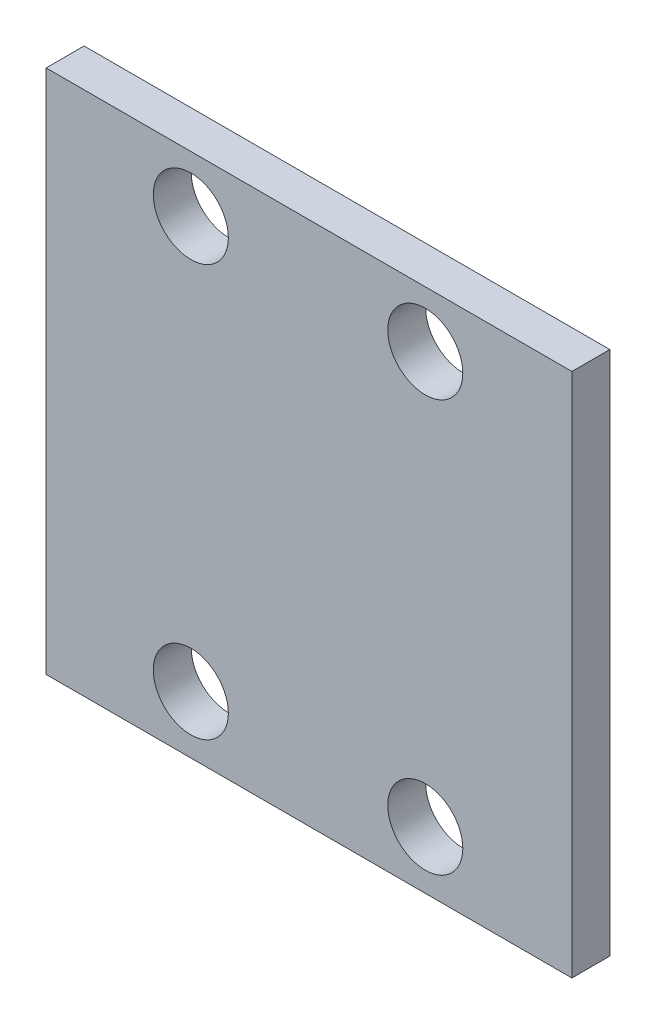
ISO-10303-21;
HEADER;
FILE_DESCRIPTION(('STEP AP214'),'2;1');
FILE_NAME('part.step','',(''),(''),'','','');
FILE_SCHEMA(('AUTOMOTIVE_DESIGN { 1 0 10303 214 1 1 1 1 }'));
ENDSEC;
DATA;
#1=APPLICATION_CONTEXT('core data for automotive mechanical design processes');
#2=APPLICATION_PROTOCOL_DEFINITION('international standard','automotive_design',2000,#1);
#3=PRODUCT_CONTEXT('',#1,'mechanical');
#4=PRODUCT('Part','Part','',(#3));
#5=PRODUCT_RELATED_PRODUCT_CATEGORY('part','',(#4));
#6=PRODUCT_DEFINITION_FORMATION('','',#4);
#7=PRODUCT_DEFINITION_CONTEXT('part definition',#1,'design');
#8=PRODUCT_DEFINITION('design','',#6,#7);
#9=PRODUCT_DEFINITION_SHAPE('','',#8);
#10=(LENGTH_UNIT() NAMED_UNIT(*) SI_UNIT(.MILLI.,.METRE.));
#11=(NAMED_UNIT(*) PLANE_ANGLE_UNIT() SI_UNIT($,.RADIAN.));
#12=(NAMED_UNIT(*) SI_UNIT($,.STERADIAN.) SOLID_ANGLE_UNIT());
#13=UNCERTAINTY_MEASURE_WITH_UNIT(LENGTH_MEASURE(1.E-05),#10,'distance_accuracy_value','');
#14=(GEOMETRIC_REPRESENTATION_CONTEXT(3) GLOBAL_UNCERTAINTY_ASSIGNED_CONTEXT((#13)) GLOBAL_UNIT_ASSIGNED_CONTEXT((#10,
#11,#12)) REPRESENTATION_CONTEXT('',''));
#15=CARTESIAN_POINT('',(0.,0.,0.));
#16=DIRECTION('',(0.,0.,1.));
#17=DIRECTION('',(1.,0.,0.));
#18=AXIS2_PLACEMENT_3D('',#15,#16,#17);
#19=CARTESIAN_POINT('',(0.,0.,-0.825000000000005));
#20=DIRECTION('',(0.,0.,-0.999999999999998));
#21=DIRECTION('',(-1.,0.,0.));
#22=AXIS2_PLACEMENT_3D('',#19,#20,#21);
#23=PLANE('',#22);
#24=CARTESIAN_POINT('',(6.28965873178001,2.50328072576878,-0.825000000000008));
#25=DIRECTION('',(0.,0.,0.999999999999998));
#26=DIRECTION('',(1.,0.,0.));
#27=AXIS2_PLACEMENT_3D('',#24,#25,#26);
#28=CIRCLE('',#27,1.63195);
#29=CARTESIAN_POINT('',(7.92160873178001,2.50328072576877,-0.825000000000008));
#30=VERTEX_POINT('',#29);
#31=EDGE_CURVE('E117',#30,#30,#28,.T.);
#32=ORIENTED_EDGE('',*,*,#31,.T.);
#33=EDGE_LOOP('',(#32));
#34=FACE_BOUND('',#33,.T.);
#35=CARTESIAN_POINT('',(16.4835065175485,2.50328072576879,-0.825000000000001));
#36=DIRECTION('',(0.,0.,0.999999999999998));
#37=DIRECTION('',(1.,0.,0.));
#38=AXIS2_PLACEMENT_3D('',#35,#36,#37);
#39=CIRCLE('',#38,1.63195);
#40=CARTESIAN_POINT('',(18.1154565175485,2.50328072576878,-0.825000000000001));
#41=VERTEX_POINT('',#40);
#42=EDGE_CURVE('E101',#41,#41,#39,.T.);
#43=ORIENTED_EDGE('',*,*,#42,.T.);
#44=EDGE_LOOP('',(#43));
#45=FACE_BOUND('',#44,.T.);
#46=DIRECTION('',(0.,0.999999999999999,0.));
#47=VECTOR('',#46,1.);
#48=CARTESIAN_POINT('',(22.8588639770681,0.,-0.824999999999999));
#49=LINE('',#48,#47);
#50=CARTESIAN_POINT('',(22.8588639770681,0.,-0.824999999999999));
#51=VERTEX_POINT('',#50);
#52=CARTESIAN_POINT('',(22.8588639770681,22.8397797418369,-0.825000000000005));
#53=VERTEX_POINT('',#52);
#54=EDGE_CURVE('E98',#51,#53,#49,.T.);
#55=ORIENTED_EDGE('',*,*,#54,.F.);
#56=DIRECTION('',(1.,0.,0.));
#57=VECTOR('',#56,1.);
#58=CARTESIAN_POINT('',(0.,0.,-0.825000000000005));
#59=LINE('',#58,#57);
#60=CARTESIAN_POINT('',(0.,0.,-0.825000000000005));
#61=VERTEX_POINT('',#60);
#62=EDGE_CURVE('E74',#61,#51,#59,.T.);
#63=ORIENTED_EDGE('',*,*,#62,.F.);
#64=DIRECTION('',(0.,-0.999999999999999,0.));
#65=VECTOR('',#64,1.);
#66=CARTESIAN_POINT('',(0.,0.,-0.825000000000005));
#67=LINE('',#66,#65);
#68=CARTESIAN_POINT('',(0.,22.8397797418369,-0.825000000000003));
#69=VERTEX_POINT('',#68);
#70=EDGE_CURVE('E68',#69,#61,#67,.T.);
#71=ORIENTED_EDGE('',*,*,#70,.F.);
#72=DIRECTION('',(-1.,0.,0.));
#73=VECTOR('',#72,1.);
#74=CARTESIAN_POINT('',(0.,22.8397797418369,-0.825000000000003));
#75=LINE('',#74,#73);
#76=EDGE_CURVE('E90',#53,#69,#75,.T.);
#77=ORIENTED_EDGE('',*,*,#76,.F.);
#78=EDGE_LOOP('',(#55,#63,#71,#77));
#79=FACE_BOUND('',#78,.T.);
#80=CARTESIAN_POINT('',(6.28965873178,20.4007563309219,-0.825000000000004));
#81=DIRECTION('',(0.,0.,0.999999999999998));
#82=DIRECTION('',(1.,0.,0.));
#83=AXIS2_PLACEMENT_3D('',#80,#81,#82);
#84=CIRCLE('',#83,1.63195);
#85=CARTESIAN_POINT('',(7.92160873178001,20.4007563309219,-0.825000000000004));
#86=VERTEX_POINT('',#85);
#87=EDGE_CURVE('E123',#86,#86,#84,.T.);
#88=ORIENTED_EDGE('',*,*,#87,.T.);
#89=EDGE_LOOP('',(#88));
#90=FACE_BOUND('',#89,.T.);
#91=CARTESIAN_POINT('',(16.4835065175485,20.4007563309218,-0.825000000000007));
#92=DIRECTION('',(0.,0.,0.999999999999998));
#93=DIRECTION('',(1.,0.,0.));
#94=AXIS2_PLACEMENT_3D('',#91,#92,#93);
#95=CIRCLE('',#94,1.63195);
#96=CARTESIAN_POINT('',(18.1154565175485,20.4007563309218,-0.825000000000007));
#97=VERTEX_POINT('',#96);
#98=EDGE_CURVE('E129',#97,#97,#95,.T.);
#99=ORIENTED_EDGE('',*,*,#98,.T.);
#100=EDGE_LOOP('',(#99));
#101=FACE_BOUND('',#100,.T.);
#102=ADVANCED_FACE('F34',(#34,#45,#79,#90,#101),#23,.T.);
#103=CARTESIAN_POINT('',(22.8588639770681,0.,0.824999999999994));
#104=DIRECTION('',(-1.,0.,0.));
#105=DIRECTION('',(0.,0.,0.999999999999998));
#106=AXIS2_PLACEMENT_3D('',#103,#104,#105);
#107=PLANE('',#106);
#108=ORIENTED_EDGE('',*,*,#54,.T.);
#109=DIRECTION('',(0.,0.,-0.999999999999998));
#110=VECTOR('',#109,1.);
#111=CARTESIAN_POINT('',(22.8588639770681,22.8397797418369,0.824999999999994));
#112=LINE('',#111,#110);
#113=CARTESIAN_POINT('',(22.8588639770681,22.8397797418369,0.824999999999994));
#114=VERTEX_POINT('',#113);
#115=EDGE_CURVE('E11',#114,#53,#112,.T.);
#116=ORIENTED_EDGE('',*,*,#115,.F.);
#117=DIRECTION('',(0.,0.999999999999999,0.));
#118=VECTOR('',#117,1.);
#119=CARTESIAN_POINT('',(22.8588639770681,0.,0.824999999999994));
#120=LINE('',#119,#118);
#121=CARTESIAN_POINT('',(22.8588639770681,0.,0.824999999999994));
#122=VERTEX_POINT('',#121);
#123=EDGE_CURVE('E86',#122,#114,#120,.T.);
#124=ORIENTED_EDGE('',*,*,#123,.F.);
#125=DIRECTION('',(0.,0.,-0.999999999999998));
#126=VECTOR('',#125,1.);
#127=CARTESIAN_POINT('',(22.8588639770681,0.,0.824999999999994));
#128=LINE('',#127,#126);
#129=EDGE_CURVE('E94',#122,#51,#128,.T.);
#130=ORIENTED_EDGE('',*,*,#129,.T.);
#131=EDGE_LOOP('',(#108,#116,#124,#130));
#132=FACE_BOUND('',#131,.T.);
#133=ADVANCED_FACE('F36',(#132),#107,.F.);
#134=CARTESIAN_POINT('',(0.,22.8397797418369,0.824999999999993));
#135=DIRECTION('',(0.,-0.999999999999999,0.));
#136=DIRECTION('',(0.,0.,-0.999999999999998));
#137=AXIS2_PLACEMENT_3D('',#134,#135,#136);
#138=PLANE('',#137);
#139=ORIENTED_EDGE('',*,*,#76,.T.);
#140=DIRECTION('',(0.,0.,-0.999999999999998));
#141=VECTOR('',#140,1.);
#142=CARTESIAN_POINT('',(0.,22.8397797418369,0.824999999999993));
#143=LINE('',#142,#141);
#144=CARTESIAN_POINT('',(0.,22.8397797418369,0.824999999999993));
#145=VERTEX_POINT('',#144);
#146=EDGE_CURVE('E43',#145,#69,#143,.T.);
#147=ORIENTED_EDGE('',*,*,#146,.F.);
#148=DIRECTION('',(-1.,0.,0.));
#149=VECTOR('',#148,1.);
#150=CARTESIAN_POINT('',(0.,22.8397797418369,0.824999999999993));
#151=LINE('',#150,#149);
#152=EDGE_CURVE('E81',#114,#145,#151,.T.);
#153=ORIENTED_EDGE('',*,*,#152,.F.);
#154=ORIENTED_EDGE('',*,*,#115,.T.);
#155=EDGE_LOOP('',(#139,#147,#153,#154));
#156=FACE_BOUND('',#155,.T.);
#157=ADVANCED_FACE('F89',(#156),#138,.F.);
#158=CARTESIAN_POINT('',(0.,0.,0.824999999999992));
#159=DIRECTION('',(1.,0.,0.));
#160=DIRECTION('',(0.,0.,-0.999999999999998));
#161=AXIS2_PLACEMENT_3D('',#158,#159,#160);
#162=PLANE('',#161);
#163=ORIENTED_EDGE('',*,*,#70,.T.);
#164=DIRECTION('',(0.,0.,-0.999999999999998));
#165=VECTOR('',#164,1.);
#166=CARTESIAN_POINT('',(0.,0.,0.824999999999992));
#167=LINE('',#166,#165);
#168=CARTESIAN_POINT('',(0.,0.,0.824999999999992));
#169=VERTEX_POINT('',#168);
#170=EDGE_CURVE('E91',#169,#61,#167,.T.);
#171=ORIENTED_EDGE('',*,*,#170,.F.);
#172=DIRECTION('',(0.,-0.999999999999999,0.));
#173=VECTOR('',#172,1.);
#174=CARTESIAN_POINT('',(0.,0.,0.824999999999992));
#175=LINE('',#174,#173);
#176=EDGE_CURVE('E84',#145,#169,#175,.T.);
#177=ORIENTED_EDGE('',*,*,#176,.F.);
#178=ORIENTED_EDGE('',*,*,#146,.T.);
#179=EDGE_LOOP('',(#163,#171,#177,#178));
#180=FACE_BOUND('',#179,.T.);
#181=ADVANCED_FACE('F92',(#180),#162,.F.);
#182=CARTESIAN_POINT('',(0.,0.,0.824999999999992));
#183=DIRECTION('',(0.,0.999999999999999,0.));
#184=DIRECTION('',(0.,0.,0.999999999999998));
#185=AXIS2_PLACEMENT_3D('',#182,#183,#184);
#186=PLANE('',#185);
#187=ORIENTED_EDGE('',*,*,#62,.T.);
#188=ORIENTED_EDGE('',*,*,#129,.F.);
#189=DIRECTION('',(1.,0.,0.));
#190=VECTOR('',#189,1.);
#191=CARTESIAN_POINT('',(0.,0.,0.824999999999992));
#192=LINE('',#191,#190);
#193=EDGE_CURVE('E51',#169,#122,#192,.T.);
#194=ORIENTED_EDGE('',*,*,#193,.F.);
#195=ORIENTED_EDGE('',*,*,#170,.T.);
#196=EDGE_LOOP('',(#187,#188,#194,#195));
#197=FACE_BOUND('',#196,.T.);
#198=ADVANCED_FACE('F106',(#197),#186,.F.);
#199=CARTESIAN_POINT('',(0.,0.,0.824999999999992));
#200=DIRECTION('',(0.,0.,-0.999999999999998));
#201=DIRECTION('',(-1.,0.,0.));
#202=AXIS2_PLACEMENT_3D('',#199,#200,#201);
#203=PLANE('',#202);
#204=CARTESIAN_POINT('',(16.4835065175485,20.4007563309218,0.824999999999992));
#205=DIRECTION('',(0.,0.,0.999999999999998));
#206=DIRECTION('',(1.,0.,0.));
#207=AXIS2_PLACEMENT_3D('',#204,#205,#206);
#208=CIRCLE('',#207,1.63195);
#209=CARTESIAN_POINT('',(18.1154565175485,20.4007563309218,0.824999999999991));
#210=VERTEX_POINT('',#209);
#211=EDGE_CURVE('E132',#210,#210,#208,.T.);
#212=ORIENTED_EDGE('',*,*,#211,.F.);
#213=EDGE_LOOP('',(#212));
#214=FACE_BOUND('',#213,.T.);
#215=CARTESIAN_POINT('',(6.28965873178001,20.4007563309219,0.825000000000001));
#216=DIRECTION('',(0.,0.,0.999999999999998));
#217=DIRECTION('',(1.,0.,0.));
#218=AXIS2_PLACEMENT_3D('',#215,#216,#217);
#219=CIRCLE('',#218,1.63195);
#220=CARTESIAN_POINT('',(7.92160873178001,20.4007563309219,0.825000000000001));
#221=VERTEX_POINT('',#220);
#222=EDGE_CURVE('E126',#221,#221,#219,.T.);
#223=ORIENTED_EDGE('',*,*,#222,.F.);
#224=EDGE_LOOP('',(#223));
#225=FACE_BOUND('',#224,.T.);
#226=CARTESIAN_POINT('',(6.28965873178001,2.50328072576877,0.824999999999992));
#227=DIRECTION('',(0.,0.,0.999999999999998));
#228=DIRECTION('',(1.,0.,0.));
#229=AXIS2_PLACEMENT_3D('',#226,#227,#228);
#230=CIRCLE('',#229,1.63195);
#231=CARTESIAN_POINT('',(7.92160873178001,2.50328072576877,0.824999999999992));
#232=VERTEX_POINT('',#231);
#233=EDGE_CURVE('E120',#232,#232,#230,.T.);
#234=ORIENTED_EDGE('',*,*,#233,.F.);
#235=EDGE_LOOP('',(#234));
#236=FACE_BOUND('',#235,.T.);
#237=CARTESIAN_POINT('',(16.4835065175485,2.50328072576878,0.824999999999999));
#238=DIRECTION('',(0.,0.,0.999999999999998));
#239=DIRECTION('',(1.,0.,0.));
#240=AXIS2_PLACEMENT_3D('',#237,#238,#239);
#241=CIRCLE('',#240,1.63195);
#242=CARTESIAN_POINT('',(18.1154565175485,2.50328072576878,0.824999999999999));
#243=VERTEX_POINT('',#242);
#244=EDGE_CURVE('E114',#243,#243,#241,.T.);
#245=ORIENTED_EDGE('',*,*,#244,.F.);
#246=EDGE_LOOP('',(#245));
#247=FACE_BOUND('',#246,.T.);
#248=ORIENTED_EDGE('',*,*,#123,.T.);
#249=ORIENTED_EDGE('',*,*,#152,.T.);
#250=ORIENTED_EDGE('',*,*,#176,.T.);
#251=ORIENTED_EDGE('',*,*,#193,.T.);
#252=EDGE_LOOP('',(#248,#249,#250,#251));
#253=FACE_BOUND('',#252,.T.);
#254=ADVANCED_FACE('F82',(#214,#225,#236,#247,#253),#203,.F.);
#255=CARTESIAN_POINT('',(16.4835065175485,2.50328072576878,0.824999999999999));
#256=DIRECTION('',(0.,0.,0.999999999999998));
#257=DIRECTION('',(1.,0.,0.));
#258=AXIS2_PLACEMENT_3D('',#255,#256,#257);
#259=CYLINDRICAL_SURFACE('',#258,1.63195);
#260=CARTESIAN_POINT('',(18.1154565175485,2.50328072576878,-0.825000000000001));
#261=CARTESIAN_POINT('',(18.1154565175485,2.50328072576878,-0.807812500000001));
#262=CARTESIAN_POINT('',(18.1154565175485,2.50328072576878,-0.790625000000001));
#263=CARTESIAN_POINT('',(18.1154565175485,2.50328072576878,-0.756250000000001));
#264=CARTESIAN_POINT('',(18.1154565175485,2.50328072576878,-0.739062500000001));
#265=CARTESIAN_POINT('',(18.1154565175485,2.50328072576878,-0.704687500000001));
#266=CARTESIAN_POINT('',(18.1154565175485,2.50328072576878,-0.687500000000001));
#267=CARTESIAN_POINT('',(18.1154565175485,2.50328072576878,-0.653125000000001));
#268=CARTESIAN_POINT('',(18.1154565175485,2.50328072576878,-0.635937500000001));
#269=CARTESIAN_POINT('',(18.1154565175485,2.50328072576878,-0.601562500000001));
#270=CARTESIAN_POINT('',(18.1154565175485,2.50328072576878,-0.584375000000001));
#271=CARTESIAN_POINT('',(18.1154565175485,2.50328072576878,-0.550000000000001));
#272=CARTESIAN_POINT('',(18.1154565175485,2.50328072576878,-0.532812500000001));
#273=CARTESIAN_POINT('',(18.1154565175485,2.50328072576878,-0.498437500000001));
#274=CARTESIAN_POINT('',(18.1154565175485,2.50328072576878,-0.481250000000001));
#275=CARTESIAN_POINT('',(18.1154565175485,2.50328072576878,-0.446875000000001));
#276=CARTESIAN_POINT('',(18.1154565175485,2.50328072576878,-0.429687500000001));
#277=CARTESIAN_POINT('',(18.1154565175485,2.50328072576878,-0.395312500000001));
#278=CARTESIAN_POINT('',(18.1154565175485,2.50328072576878,-0.378125000000001));
#279=CARTESIAN_POINT('',(18.1154565175485,2.50328072576878,-0.343750000000001));
#280=CARTESIAN_POINT('',(18.1154565175485,2.50328072576878,-0.326562500000001));
#281=CARTESIAN_POINT('',(18.1154565175485,2.50328072576878,-0.292187500000001));
#282=CARTESIAN_POINT('',(18.1154565175485,2.50328072576878,-0.275000000000001));
#283=CARTESIAN_POINT('',(18.1154565175485,2.50328072576878,-0.240625000000001));
#284=CARTESIAN_POINT('',(18.1154565175485,2.50328072576878,-0.223437500000001));
#285=CARTESIAN_POINT('',(18.1154565175485,2.50328072576878,-0.189062500000001));
#286=CARTESIAN_POINT('',(18.1154565175485,2.50328072576878,-0.171875000000001));
#287=CARTESIAN_POINT('',(18.1154565175485,2.50328072576878,-0.137500000000001));
#288=CARTESIAN_POINT('',(18.1154565175485,2.50328072576878,-0.120312500000001));
#289=CARTESIAN_POINT('',(18.1154565175485,2.50328072576878,-0.0859375000000009));
#290=CARTESIAN_POINT('',(18.1154565175485,2.50328072576878,-0.0687500000000008));
#291=CARTESIAN_POINT('',(18.1154565175485,2.50328072576878,-0.0343750000000008));
#292=CARTESIAN_POINT('',(18.1154565175485,2.50328072576878,-0.0171875000000009));
#293=CARTESIAN_POINT('',(18.1154565175485,2.50328072576878,0.0171874999999991));
#294=CARTESIAN_POINT('',(18.1154565175485,2.50328072576878,0.0343749999999991));
#295=CARTESIAN_POINT('',(18.1154565175485,2.50328072576878,0.0687499999999991));
#296=CARTESIAN_POINT('',(18.1154565175485,2.50328072576878,0.0859374999999991));
#297=CARTESIAN_POINT('',(18.1154565175485,2.50328072576878,0.120312499999999));
#298=CARTESIAN_POINT('',(18.1154565175485,2.50328072576878,0.137499999999999));
#299=CARTESIAN_POINT('',(18.1154565175485,2.50328072576878,0.171874999999999));
#300=CARTESIAN_POINT('',(18.1154565175485,2.50328072576878,0.189062499999999));
#301=CARTESIAN_POINT('',(18.1154565175485,2.50328072576878,0.223437499999999));
#302=CARTESIAN_POINT('',(18.1154565175485,2.50328072576878,0.240624999999999));
#303=CARTESIAN_POINT('',(18.1154565175485,2.50328072576878,0.274999999999999));
#304=CARTESIAN_POINT('',(18.1154565175485,2.50328072576878,0.292187499999999));
#305=CARTESIAN_POINT('',(18.1154565175485,2.50328072576878,0.326562499999999));
#306=CARTESIAN_POINT('',(18.1154565175485,2.50328072576878,0.343749999999999));
#307=CARTESIAN_POINT('',(18.1154565175485,2.50328072576878,0.378124999999999));
#308=CARTESIAN_POINT('',(18.1154565175485,2.50328072576878,0.395312499999999));
#309=CARTESIAN_POINT('',(18.1154565175485,2.50328072576878,0.429687499999999));
#310=CARTESIAN_POINT('',(18.1154565175485,2.50328072576878,0.446874999999999));
#311=CARTESIAN_POINT('',(18.1154565175485,2.50328072576878,0.481249999999999));
#312=CARTESIAN_POINT('',(18.1154565175485,2.50328072576878,0.498437499999999));
#313=CARTESIAN_POINT('',(18.1154565175485,2.50328072576878,0.532812499999999));
#314=CARTESIAN_POINT('',(18.1154565175485,2.50328072576878,0.549999999999999));
#315=CARTESIAN_POINT('',(18.1154565175485,2.50328072576878,0.584374999999999));
#316=CARTESIAN_POINT('',(18.1154565175485,2.50328072576878,0.601562499999999));
#317=CARTESIAN_POINT('',(18.1154565175485,2.50328072576878,0.635937499999999));
#318=CARTESIAN_POINT('',(18.1154565175485,2.50328072576878,0.653124999999999));
#319=CARTESIAN_POINT('',(18.1154565175485,2.50328072576878,0.687499999999999));
#320=CARTESIAN_POINT('',(18.1154565175485,2.50328072576878,0.704687499999999));
#321=CARTESIAN_POINT('',(18.1154565175485,2.50328072576878,0.739062499999999));
#322=CARTESIAN_POINT('',(18.1154565175485,2.50328072576878,0.756249999999999));
#323=CARTESIAN_POINT('',(18.1154565175485,2.50328072576878,0.790624999999999));
#324=CARTESIAN_POINT('',(18.1154565175485,2.50328072576878,0.807812499999999));
#325=CARTESIAN_POINT('',(18.1154565175485,2.50328072576878,0.824999999999999));
#326=B_SPLINE_CURVE_WITH_KNOTS('',3,(#260,#261,#262,#263,#264,#265,#266,#267,#268,#269,#270,
#271,#272,#273,#274,#275,#276,#277,#278,#279,#280,#281,#282,#283,#284,#285,#286,#287,#288,#289,
#290,#291,#292,#293,#294,#295,#296,#297,#298,#299,#300,#301,#302,#303,#304,#305,#306,#307,#308,
#309,#310,#311,#312,#313,#314,#315,#316,#317,#318,#319,#320,#321,#322,#323,#324,#325),
.UNSPECIFIED.,.F.,.F.,(4,2,2,2,2,2,2,2,2,2,2,2,2,2,2,2,2,2,2,2,2,2,2,2,2,2,2,2,2,2,2,2,4),(0.,
0.0515625,0.103125,0.1546875,0.20625,0.2578125,0.309375,0.3609375,0.4125,0.4640625,0.515625,
0.5671875,0.61875,0.6703125,0.721875,0.7734375,0.825,0.8765625,0.928125,0.9796875,1.03125,
1.0828125,1.134375,1.1859375,1.2375,1.2890625,1.340625,1.3921875,1.44375,1.4953125,1.546875,
1.5984375,1.65),.UNSPECIFIED.);
#327=EDGE_CURVE('BSEAM140',#41,#243,#326,.T.);
#328=ORIENTED_EDGE('',*,*,#42,.F.);
#329=ORIENTED_EDGE('',*,*,#244,.T.);
#330=ORIENTED_EDGE('',*,*,#327,.T.);
#331=ORIENTED_EDGE('',*,*,#327,.F.);
#332=EDGE_LOOP('',(#328,#330,#329,#331));
#333=FACE_BOUND('',#332,.T.);
#334=ADVANCED_FACE('F140',(#333),#259,.F.);
#335=CARTESIAN_POINT('',(6.28965873178001,2.50328072576877,0.824999999999992));
#336=DIRECTION('',(0.,0.,0.999999999999998));
#337=DIRECTION('',(1.,0.,0.));
#338=AXIS2_PLACEMENT_3D('',#335,#336,#337);
#339=CYLINDRICAL_SURFACE('',#338,1.63195);
#340=CARTESIAN_POINT('',(7.92160873178001,2.50328072576877,-0.825000000000008));
#341=CARTESIAN_POINT('',(7.92160873178001,2.50328072576877,-0.807812500000008));
#342=CARTESIAN_POINT('',(7.92160873178001,2.50328072576877,-0.790625000000008));
#343=CARTESIAN_POINT('',(7.92160873178001,2.50328072576877,-0.756250000000008));
#344=CARTESIAN_POINT('',(7.92160873178001,2.50328072576877,-0.739062500000008));
#345=CARTESIAN_POINT('',(7.92160873178001,2.50328072576877,-0.704687500000008));
#346=CARTESIAN_POINT('',(7.92160873178001,2.50328072576877,-0.687500000000008));
#347=CARTESIAN_POINT('',(7.92160873178001,2.50328072576877,-0.653125000000008));
#348=CARTESIAN_POINT('',(7.92160873178001,2.50328072576877,-0.635937500000008));
#349=CARTESIAN_POINT('',(7.92160873178001,2.50328072576877,-0.601562500000008));
#350=CARTESIAN_POINT('',(7.92160873178001,2.50328072576877,-0.584375000000008));
#351=CARTESIAN_POINT('',(7.92160873178001,2.50328072576877,-0.550000000000008));
#352=CARTESIAN_POINT('',(7.92160873178001,2.50328072576877,-0.532812500000008));
#353=CARTESIAN_POINT('',(7.92160873178001,2.50328072576877,-0.498437500000008));
#354=CARTESIAN_POINT('',(7.92160873178001,2.50328072576877,-0.481250000000008));
#355=CARTESIAN_POINT('',(7.92160873178001,2.50328072576877,-0.446875000000008));
#356=CARTESIAN_POINT('',(7.92160873178001,2.50328072576877,-0.429687500000008));
#357=CARTESIAN_POINT('',(7.92160873178001,2.50328072576877,-0.395312500000008));
#358=CARTESIAN_POINT('',(7.92160873178001,2.50328072576877,-0.378125000000008));
#359=CARTESIAN_POINT('',(7.92160873178001,2.50328072576877,-0.343750000000008));
#360=CARTESIAN_POINT('',(7.92160873178001,2.50328072576877,-0.326562500000008));
#361=CARTESIAN_POINT('',(7.92160873178001,2.50328072576877,-0.292187500000008));
#362=CARTESIAN_POINT('',(7.92160873178001,2.50328072576877,-0.275000000000008));
#363=CARTESIAN_POINT('',(7.92160873178001,2.50328072576877,-0.240625000000008));
#364=CARTESIAN_POINT('',(7.92160873178001,2.50328072576877,-0.223437500000008));
#365=CARTESIAN_POINT('',(7.92160873178001,2.50328072576877,-0.189062500000008));
#366=CARTESIAN_POINT('',(7.92160873178001,2.50328072576877,-0.171875000000008));
#367=CARTESIAN_POINT('',(7.92160873178001,2.50328072576877,-0.137500000000008));
#368=CARTESIAN_POINT('',(7.92160873178001,2.50328072576877,-0.120312500000008));
#369=CARTESIAN_POINT('',(7.92160873178001,2.50328072576877,-0.0859375000000078));
#370=CARTESIAN_POINT('',(7.92160873178001,2.50328072576877,-0.0687500000000078));
#371=CARTESIAN_POINT('',(7.92160873178001,2.50328072576877,-0.0343750000000078));
#372=CARTESIAN_POINT('',(7.92160873178001,2.50328072576877,-0.0171875000000078));
#373=CARTESIAN_POINT('',(7.92160873178001,2.50328072576877,0.0171874999999922));
#374=CARTESIAN_POINT('',(7.92160873178001,2.50328072576877,0.0343749999999922));
#375=CARTESIAN_POINT('',(7.92160873178001,2.50328072576877,0.0687499999999921));
#376=CARTESIAN_POINT('',(7.92160873178001,2.50328072576877,0.0859374999999921));
#377=CARTESIAN_POINT('',(7.92160873178001,2.50328072576877,0.120312499999992));
#378=CARTESIAN_POINT('',(7.92160873178001,2.50328072576877,0.137499999999992));
#379=CARTESIAN_POINT('',(7.92160873178001,2.50328072576877,0.171874999999992));
#380=CARTESIAN_POINT('',(7.92160873178001,2.50328072576877,0.189062499999992));
#381=CARTESIAN_POINT('',(7.92160873178001,2.50328072576877,0.223437499999992));
#382=CARTESIAN_POINT('',(7.92160873178001,2.50328072576877,0.240624999999992));
#383=CARTESIAN_POINT('',(7.92160873178001,2.50328072576877,0.274999999999992));
#384=CARTESIAN_POINT('',(7.92160873178001,2.50328072576877,0.292187499999992));
#385=CARTESIAN_POINT('',(7.92160873178001,2.50328072576877,0.326562499999992));
#386=CARTESIAN_POINT('',(7.92160873178001,2.50328072576877,0.343749999999992));
#387=CARTESIAN_POINT('',(7.92160873178001,2.50328072576877,0.378124999999992));
#388=CARTESIAN_POINT('',(7.92160873178001,2.50328072576877,0.395312499999992));
#389=CARTESIAN_POINT('',(7.92160873178001,2.50328072576877,0.429687499999992));
#390=CARTESIAN_POINT('',(7.92160873178001,2.50328072576877,0.446874999999992));
#391=CARTESIAN_POINT('',(7.92160873178001,2.50328072576877,0.481249999999992));
#392=CARTESIAN_POINT('',(7.92160873178001,2.50328072576877,0.498437499999992));
#393=CARTESIAN_POINT('',(7.92160873178001,2.50328072576877,0.532812499999992));
#394=CARTESIAN_POINT('',(7.92160873178001,2.50328072576877,0.549999999999992));
#395=CARTESIAN_POINT('',(7.92160873178001,2.50328072576877,0.584374999999992));
#396=CARTESIAN_POINT('',(7.92160873178001,2.50328072576877,0.601562499999992));
#397=CARTESIAN_POINT('',(7.92160873178001,2.50328072576877,0.635937499999992));
#398=CARTESIAN_POINT('',(7.92160873178001,2.50328072576877,0.653124999999992));
#399=CARTESIAN_POINT('',(7.92160873178001,2.50328072576877,0.687499999999992));
#400=CARTESIAN_POINT('',(7.92160873178001,2.50328072576877,0.704687499999992));
#401=CARTESIAN_POINT('',(7.92160873178001,2.50328072576877,0.739062499999992));
#402=CARTESIAN_POINT('',(7.92160873178001,2.50328072576877,0.756249999999992));
#403=CARTESIAN_POINT('',(7.92160873178001,2.50328072576877,0.790624999999992));
#404=CARTESIAN_POINT('',(7.92160873178001,2.50328072576877,0.807812499999992));
#405=CARTESIAN_POINT('',(7.92160873178001,2.50328072576877,0.824999999999992));
#406=B_SPLINE_CURVE_WITH_KNOTS('',3,(#340,#341,#342,#343,#344,#345,#346,#347,#348,#349,#350,
#351,#352,#353,#354,#355,#356,#357,#358,#359,#360,#361,#362,#363,#364,#365,#366,#367,#368,#369,
#370,#371,#372,#373,#374,#375,#376,#377,#378,#379,#380,#381,#382,#383,#384,#385,#386,#387,#388,
#389,#390,#391,#392,#393,#394,#395,#396,#397,#398,#399,#400,#401,#402,#403,#404,#405),
.UNSPECIFIED.,.F.,.F.,(4,2,2,2,2,2,2,2,2,2,2,2,2,2,2,2,2,2,2,2,2,2,2,2,2,2,2,2,2,2,2,2,4),(0.,
0.0515625,0.103125,0.1546875,0.20625,0.2578125,0.309375,0.3609375,0.4125,0.4640625,0.515625,
0.5671875,0.61875,0.6703125,0.721875,0.7734375,0.825,0.8765625,0.928125,0.9796875,1.03125,
1.0828125,1.134375,1.1859375,1.2375,1.2890625,1.340625,1.3921875,1.44375,1.4953125,1.546875,
1.5984375,1.65),.UNSPECIFIED.);
#407=EDGE_CURVE('BSEAM149',#30,#232,#406,.T.);
#408=ORIENTED_EDGE('',*,*,#31,.F.);
#409=ORIENTED_EDGE('',*,*,#233,.T.);
#410=ORIENTED_EDGE('',*,*,#407,.T.);
#411=ORIENTED_EDGE('',*,*,#407,.F.);
#412=EDGE_LOOP('',(#408,#410,#409,#411));
#413=FACE_BOUND('',#412,.T.);
#414=ADVANCED_FACE('F149',(#413),#339,.F.);
#415=CARTESIAN_POINT('',(6.28965873178001,20.4007563309219,0.825000000000001));
#416=DIRECTION('',(0.,0.,0.999999999999998));
#417=DIRECTION('',(1.,0.,0.));
#418=AXIS2_PLACEMENT_3D('',#415,#416,#417);
#419=CYLINDRICAL_SURFACE('',#418,1.63195);
#420=CARTESIAN_POINT('',(7.92160873178001,20.4007563309219,-0.825000000000004));
#421=CARTESIAN_POINT('',(7.92160873178001,20.4007563309219,-0.807812500000004));
#422=CARTESIAN_POINT('',(7.92160873178001,20.4007563309219,-0.790625000000004));
#423=CARTESIAN_POINT('',(7.92160873178001,20.4007563309219,-0.756250000000004));
#424=CARTESIAN_POINT('',(7.92160873178001,20.4007563309219,-0.739062500000004));
#425=CARTESIAN_POINT('',(7.92160873178001,20.4007563309219,-0.704687500000003));
#426=CARTESIAN_POINT('',(7.92160873178001,20.4007563309219,-0.687500000000003));
#427=CARTESIAN_POINT('',(7.92160873178001,20.4007563309219,-0.653125000000003));
#428=CARTESIAN_POINT('',(7.92160873178001,20.4007563309219,-0.635937500000003));
#429=CARTESIAN_POINT('',(7.92160873178001,20.4007563309219,-0.601562500000003));
#430=CARTESIAN_POINT('',(7.92160873178001,20.4007563309219,-0.584375000000003));
#431=CARTESIAN_POINT('',(7.92160873178001,20.4007563309219,-0.550000000000003));
#432=CARTESIAN_POINT('',(7.92160873178001,20.4007563309219,-0.532812500000003));
#433=CARTESIAN_POINT('',(7.92160873178001,20.4007563309219,-0.498437500000003));
#434=CARTESIAN_POINT('',(7.92160873178001,20.4007563309219,-0.481250000000003));
#435=CARTESIAN_POINT('',(7.92160873178001,20.4007563309219,-0.446875000000003));
#436=CARTESIAN_POINT('',(7.92160873178001,20.4007563309219,-0.429687500000003));
#437=CARTESIAN_POINT('',(7.92160873178001,20.4007563309219,-0.395312500000002));
#438=CARTESIAN_POINT('',(7.92160873178001,20.4007563309219,-0.378125000000002));
#439=CARTESIAN_POINT('',(7.92160873178001,20.4007563309219,-0.343750000000002));
#440=CARTESIAN_POINT('',(7.92160873178001,20.4007563309219,-0.326562500000002));
#441=CARTESIAN_POINT('',(7.92160873178001,20.4007563309219,-0.292187500000002));
#442=CARTESIAN_POINT('',(7.92160873178001,20.4007563309219,-0.275000000000002));
#443=CARTESIAN_POINT('',(7.92160873178001,20.4007563309219,-0.240625000000002));
#444=CARTESIAN_POINT('',(7.92160873178001,20.4007563309219,-0.223437500000002));
#445=CARTESIAN_POINT('',(7.92160873178001,20.4007563309219,-0.189062500000002));
#446=CARTESIAN_POINT('',(7.92160873178001,20.4007563309219,-0.171875000000002));
#447=CARTESIAN_POINT('',(7.92160873178001,20.4007563309219,-0.137500000000002));
#448=CARTESIAN_POINT('',(7.92160873178001,20.4007563309219,-0.120312500000002));
#449=CARTESIAN_POINT('',(7.92160873178001,20.4007563309219,-0.0859375000000016));
#450=CARTESIAN_POINT('',(7.92160873178001,20.4007563309219,-0.0687500000000015));
#451=CARTESIAN_POINT('',(7.92160873178001,20.4007563309219,-0.0343750000000013));
#452=CARTESIAN_POINT('',(7.92160873178001,20.4007563309219,-0.0171875000000013));
#453=CARTESIAN_POINT('',(7.92160873178001,20.4007563309219,0.0171874999999987));
#454=CARTESIAN_POINT('',(7.92160873178001,20.4007563309219,0.0343749999999987));
#455=CARTESIAN_POINT('',(7.92160873178001,20.4007563309219,0.0687499999999988));
#456=CARTESIAN_POINT('',(7.92160873178001,20.4007563309219,0.0859374999999989));
#457=CARTESIAN_POINT('',(7.92160873178001,20.4007563309219,0.120312499999999));
#458=CARTESIAN_POINT('',(7.92160873178001,20.4007563309219,0.137499999999999));
#459=CARTESIAN_POINT('',(7.92160873178001,20.4007563309219,0.171874999999999));
#460=CARTESIAN_POINT('',(7.92160873178001,20.4007563309219,0.189062499999999));
#461=CARTESIAN_POINT('',(7.92160873178001,20.4007563309219,0.223437499999999));
#462=CARTESIAN_POINT('',(7.92160873178001,20.4007563309219,0.240624999999999));
#463=CARTESIAN_POINT('',(7.92160873178001,20.4007563309219,0.274999999999999));
#464=CARTESIAN_POINT('',(7.92160873178001,20.4007563309219,0.2921875));
#465=CARTESIAN_POINT('',(7.92160873178001,20.4007563309219,0.3265625));
#466=CARTESIAN_POINT('',(7.92160873178001,20.4007563309219,0.34375));
#467=CARTESIAN_POINT('',(7.92160873178001,20.4007563309219,0.378125));
#468=CARTESIAN_POINT('',(7.92160873178001,20.4007563309219,0.3953125));
#469=CARTESIAN_POINT('',(7.92160873178001,20.4007563309219,0.4296875));
#470=CARTESIAN_POINT('',(7.92160873178001,20.4007563309219,0.446875));
#471=CARTESIAN_POINT('',(7.92160873178001,20.4007563309219,0.48125));
#472=CARTESIAN_POINT('',(7.92160873178001,20.4007563309219,0.4984375));
#473=CARTESIAN_POINT('',(7.92160873178001,20.4007563309219,0.5328125));
#474=CARTESIAN_POINT('',(7.92160873178001,20.4007563309219,0.55));
#475=CARTESIAN_POINT('',(7.92160873178001,20.4007563309219,0.584375));
#476=CARTESIAN_POINT('',(7.92160873178001,20.4007563309219,0.6015625));
#477=CARTESIAN_POINT('',(7.92160873178001,20.4007563309219,0.6359375));
#478=CARTESIAN_POINT('',(7.92160873178001,20.4007563309219,0.653125000000001));
#479=CARTESIAN_POINT('',(7.92160873178001,20.4007563309219,0.687500000000001));
#480=CARTESIAN_POINT('',(7.92160873178001,20.4007563309219,0.704687500000001));
#481=CARTESIAN_POINT('',(7.92160873178001,20.4007563309219,0.739062500000001));
#482=CARTESIAN_POINT('',(7.92160873178001,20.4007563309219,0.756250000000001));
#483=CARTESIAN_POINT('',(7.92160873178001,20.4007563309219,0.790625000000001));
#484=CARTESIAN_POINT('',(7.92160873178001,20.4007563309219,0.807812500000001));
#485=CARTESIAN_POINT('',(7.92160873178001,20.4007563309219,0.825000000000001));
#486=B_SPLINE_CURVE_WITH_KNOTS('',3,(#420,#421,#422,#423,#424,#425,#426,#427,#428,#429,#430,
#431,#432,#433,#434,#435,#436,#437,#438,#439,#440,#441,#442,#443,#444,#445,#446,#447,#448,#449,
#450,#451,#452,#453,#454,#455,#456,#457,#458,#459,#460,#461,#462,#463,#464,#465,#466,#467,#468,
#469,#470,#471,#472,#473,#474,#475,#476,#477,#478,#479,#480,#481,#482,#483,#484,#485),
.UNSPECIFIED.,.F.,.F.,(4,2,2,2,2,2,2,2,2,2,2,2,2,2,2,2,2,2,2,2,2,2,2,2,2,2,2,2,2,2,2,2,4),(0.,
0.0515625,0.103125,0.154687500000001,0.20625,0.257812500000001,0.309375000000001,
0.360937500000001,0.412500000000001,0.464062500000001,0.515625000000001,0.567187500000002,
0.618750000000002,0.670312500000002,0.721875000000002,0.773437500000002,0.825000000000002,
0.876562500000002,0.928125000000003,0.979687500000003,1.03125,1.0828125,1.134375,1.1859375,
1.2375,1.2890625,1.340625,1.3921875,1.44375,1.4953125,1.546875,1.5984375,1.65),.UNSPECIFIED.);
#487=EDGE_CURVE('BSEAM155',#86,#221,#486,.T.);
#488=ORIENTED_EDGE('',*,*,#87,.F.);
#489=ORIENTED_EDGE('',*,*,#222,.T.);
#490=ORIENTED_EDGE('',*,*,#487,.T.);
#491=ORIENTED_EDGE('',*,*,#487,.F.);
#492=EDGE_LOOP('',(#488,#490,#489,#491));
#493=FACE_BOUND('',#492,.T.);
#494=ADVANCED_FACE('F155',(#493),#419,.F.);
#495=CARTESIAN_POINT('',(16.4835065175485,20.4007563309218,0.824999999999992));
#496=DIRECTION('',(0.,0.,0.999999999999998));
#497=DIRECTION('',(1.,0.,0.));
#498=AXIS2_PLACEMENT_3D('',#495,#496,#497);
#499=CYLINDRICAL_SURFACE('',#498,1.63195);
#500=CARTESIAN_POINT('',(18.1154565175485,20.4007563309218,-0.825000000000007));
#501=CARTESIAN_POINT('',(18.1154565175485,20.4007563309218,-0.807812500000007));
#502=CARTESIAN_POINT('',(18.1154565175485,20.4007563309218,-0.790625000000007));
#503=CARTESIAN_POINT('',(18.1154565175485,20.4007563309218,-0.756250000000007));
#504=CARTESIAN_POINT('',(18.1154565175485,20.4007563309218,-0.739062500000007));
#505=CARTESIAN_POINT('',(18.1154565175485,20.4007563309218,-0.704687500000007));
#506=CARTESIAN_POINT('',(18.1154565175485,20.4007563309218,-0.687500000000007));
#507=CARTESIAN_POINT('',(18.1154565175485,20.4007563309218,-0.653125000000007));
#508=CARTESIAN_POINT('',(18.1154565175485,20.4007563309218,-0.635937500000007));
#509=CARTESIAN_POINT('',(18.1154565175485,20.4007563309218,-0.601562500000007));
#510=CARTESIAN_POINT('',(18.1154565175485,20.4007563309218,-0.584375000000007));
#511=CARTESIAN_POINT('',(18.1154565175485,20.4007563309218,-0.550000000000007));
#512=CARTESIAN_POINT('',(18.1154565175485,20.4007563309218,-0.532812500000007));
#513=CARTESIAN_POINT('',(18.1154565175485,20.4007563309218,-0.498437500000007));
#514=CARTESIAN_POINT('',(18.1154565175485,20.4007563309218,-0.481250000000008));
#515=CARTESIAN_POINT('',(18.1154565175485,20.4007563309218,-0.446875000000008));
#516=CARTESIAN_POINT('',(18.1154565175485,20.4007563309218,-0.429687500000008));
#517=CARTESIAN_POINT('',(18.1154565175485,20.4007563309218,-0.395312500000007));
#518=CARTESIAN_POINT('',(18.1154565175485,20.4007563309218,-0.378125000000007));
#519=CARTESIAN_POINT('',(18.1154565175485,20.4007563309218,-0.343750000000007));
#520=CARTESIAN_POINT('',(18.1154565175485,20.4007563309218,-0.326562500000007));
#521=CARTESIAN_POINT('',(18.1154565175485,20.4007563309218,-0.292187500000008));
#522=CARTESIAN_POINT('',(18.1154565175485,20.4007563309218,-0.275000000000008));
#523=CARTESIAN_POINT('',(18.1154565175485,20.4007563309218,-0.240625000000008));
#524=CARTESIAN_POINT('',(18.1154565175485,20.4007563309218,-0.223437500000008));
#525=CARTESIAN_POINT('',(18.1154565175485,20.4007563309218,-0.189062500000008));
#526=CARTESIAN_POINT('',(18.1154565175485,20.4007563309218,-0.171875000000008));
#527=CARTESIAN_POINT('',(18.1154565175485,20.4007563309218,-0.137500000000008));
#528=CARTESIAN_POINT('',(18.1154565175485,20.4007563309218,-0.120312500000008));
#529=CARTESIAN_POINT('',(18.1154565175485,20.4007563309218,-0.0859375000000078));
#530=CARTESIAN_POINT('',(18.1154565175485,20.4007563309218,-0.0687500000000078));
#531=CARTESIAN_POINT('',(18.1154565175485,20.4007563309218,-0.0343750000000078));
#532=CARTESIAN_POINT('',(18.1154565175485,20.4007563309218,-0.0171875000000078));
#533=CARTESIAN_POINT('',(18.1154565175485,20.4007563309218,0.0171874999999922));
#534=CARTESIAN_POINT('',(18.1154565175485,20.4007563309218,0.0343749999999922));
#535=CARTESIAN_POINT('',(18.1154565175485,20.4007563309218,0.0687499999999921));
#536=CARTESIAN_POINT('',(18.1154565175485,20.4007563309218,0.0859374999999921));
#537=CARTESIAN_POINT('',(18.1154565175485,20.4007563309218,0.120312499999992));
#538=CARTESIAN_POINT('',(18.1154565175485,20.4007563309218,0.137499999999992));
#539=CARTESIAN_POINT('',(18.1154565175485,20.4007563309218,0.171874999999992));
#540=CARTESIAN_POINT('',(18.1154565175485,20.4007563309218,0.189062499999992));
#541=CARTESIAN_POINT('',(18.1154565175485,20.4007563309218,0.223437499999992));
#542=CARTESIAN_POINT('',(18.1154565175485,20.4007563309218,0.240624999999992));
#543=CARTESIAN_POINT('',(18.1154565175485,20.4007563309218,0.274999999999992));
#544=CARTESIAN_POINT('',(18.1154565175485,20.4007563309218,0.292187499999992));
#545=CARTESIAN_POINT('',(18.1154565175485,20.4007563309218,0.326562499999992));
#546=CARTESIAN_POINT('',(18.1154565175485,20.4007563309218,0.343749999999992));
#547=CARTESIAN_POINT('',(18.1154565175485,20.4007563309218,0.378124999999992));
#548=CARTESIAN_POINT('',(18.1154565175485,20.4007563309218,0.395312499999992));
#549=CARTESIAN_POINT('',(18.1154565175485,20.4007563309218,0.429687499999992));
#550=CARTESIAN_POINT('',(18.1154565175485,20.4007563309218,0.446874999999992));
#551=CARTESIAN_POINT('',(18.1154565175485,20.4007563309218,0.481249999999992));
#552=CARTESIAN_POINT('',(18.1154565175485,20.4007563309218,0.498437499999992));
#553=CARTESIAN_POINT('',(18.1154565175485,20.4007563309218,0.532812499999992));
#554=CARTESIAN_POINT('',(18.1154565175485,20.4007563309218,0.549999999999992));
#555=CARTESIAN_POINT('',(18.1154565175485,20.4007563309218,0.584374999999992));
#556=CARTESIAN_POINT('',(18.1154565175485,20.4007563309218,0.601562499999992));
#557=CARTESIAN_POINT('',(18.1154565175485,20.4007563309218,0.635937499999992));
#558=CARTESIAN_POINT('',(18.1154565175485,20.4007563309218,0.653124999999992));
#559=CARTESIAN_POINT('',(18.1154565175485,20.4007563309218,0.687499999999992));
#560=CARTESIAN_POINT('',(18.1154565175485,20.4007563309218,0.704687499999992));
#561=CARTESIAN_POINT('',(18.1154565175485,20.4007563309218,0.739062499999992));
#562=CARTESIAN_POINT('',(18.1154565175485,20.4007563309218,0.756249999999992));
#563=CARTESIAN_POINT('',(18.1154565175485,20.4007563309218,0.790624999999992));
#564=CARTESIAN_POINT('',(18.1154565175485,20.4007563309218,0.807812499999992));
#565=CARTESIAN_POINT('',(18.1154565175485,20.4007563309218,0.824999999999992));
#566=B_SPLINE_CURVE_WITH_KNOTS('',3,(#500,#501,#502,#503,#504,#505,#506,#507,#508,#509,#510,
#511,#512,#513,#514,#515,#516,#517,#518,#519,#520,#521,#522,#523,#524,#525,#526,#527,#528,#529,
#530,#531,#532,#533,#534,#535,#536,#537,#538,#539,#540,#541,#542,#543,#544,#545,#546,#547,#548,
#549,#550,#551,#552,#553,#554,#555,#556,#557,#558,#559,#560,#561,#562,#563,#564,#565),
.UNSPECIFIED.,.F.,.F.,(4,2,2,2,2,2,2,2,2,2,2,2,2,2,2,2,2,2,2,2,2,2,2,2,2,2,2,2,2,2,2,2,4),(0.,
0.0515624999999997,0.103125,0.1546875,0.20625,0.2578125,0.309375,0.3609375,0.4125,0.4640625,
0.515625,0.5671875,0.618749999999999,0.670312499999999,0.721874999999999,0.773437499999999,
0.824999999999999,0.876562499999999,0.928124999999999,0.979687499999999,1.03125,1.0828125,
1.134375,1.1859375,1.2375,1.2890625,1.340625,1.3921875,1.44375,1.4953125,1.546875,1.5984375,
1.65),.UNSPECIFIED.);
#567=EDGE_CURVE('BSEAM136',#97,#210,#566,.T.);
#568=ORIENTED_EDGE('',*,*,#98,.F.);
#569=ORIENTED_EDGE('',*,*,#211,.T.);
#570=ORIENTED_EDGE('',*,*,#567,.T.);
#571=ORIENTED_EDGE('',*,*,#567,.F.);
#572=EDGE_LOOP('',(#568,#570,#569,#571));
#573=FACE_BOUND('',#572,.T.);
#574=ADVANCED_FACE('F136',(#573),#499,.F.);
#575=CLOSED_SHELL('',(#102,#133,#157,#181,#198,#254,#334,#414,#494,#574));
#576=MANIFOLD_SOLID_BREP('B2',#575);
#577=ADVANCED_BREP_SHAPE_REPRESENTATION('',(#18,#576),#14);
#578=SHAPE_DEFINITION_REPRESENTATION(#9,#577);
ENDSEC;
END-ISO-10303-21;
